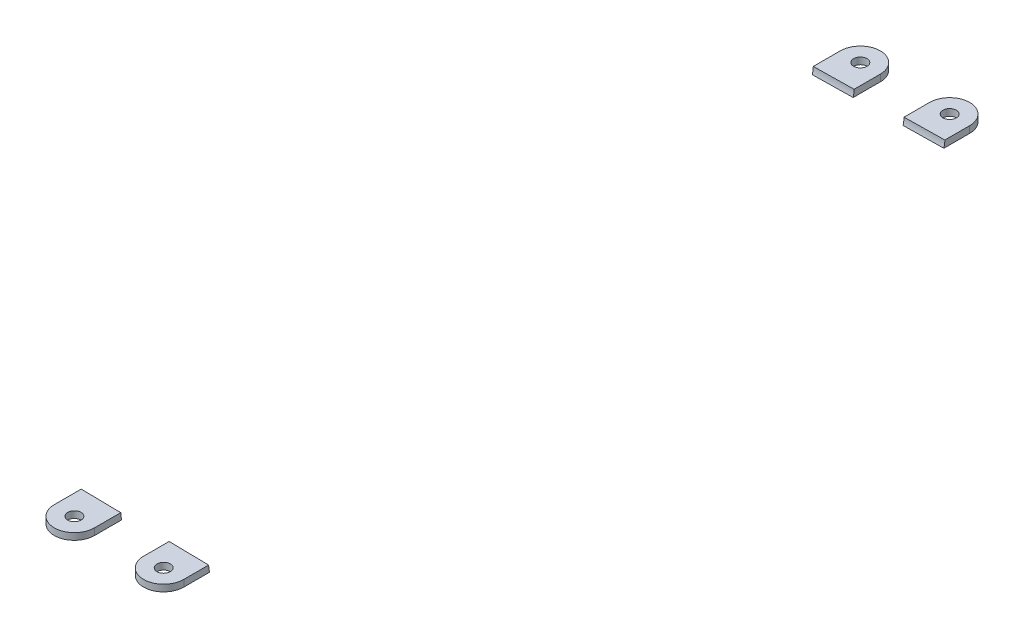
ISO-10303-21;
HEADER;
FILE_DESCRIPTION(('STEP AP214'),'2;1');
FILE_NAME('part.step','',(''),(''),'','','');
FILE_SCHEMA(('AUTOMOTIVE_DESIGN { 1 0 10303 214 1 1 1 1 }'));
ENDSEC;
DATA;
#1=APPLICATION_CONTEXT('core data for automotive mechanical design processes');
#2=APPLICATION_PROTOCOL_DEFINITION('international standard','automotive_design',2000,#1);
#3=PRODUCT_CONTEXT('',#1,'mechanical');
#4=PRODUCT('Part','Part','',(#3));
#5=PRODUCT_RELATED_PRODUCT_CATEGORY('part','',(#4));
#6=PRODUCT_DEFINITION_FORMATION('','',#4);
#7=PRODUCT_DEFINITION_CONTEXT('part definition',#1,'design');
#8=PRODUCT_DEFINITION('design','',#6,#7);
#9=PRODUCT_DEFINITION_SHAPE('','',#8);
#10=(LENGTH_UNIT() NAMED_UNIT(*) SI_UNIT(.MILLI.,.METRE.));
#11=(NAMED_UNIT(*) PLANE_ANGLE_UNIT() SI_UNIT($,.RADIAN.));
#12=(NAMED_UNIT(*) SI_UNIT($,.STERADIAN.) SOLID_ANGLE_UNIT());
#13=UNCERTAINTY_MEASURE_WITH_UNIT(LENGTH_MEASURE(1.E-05),#10,'distance_accuracy_value','');
#14=(GEOMETRIC_REPRESENTATION_CONTEXT(3) GLOBAL_UNCERTAINTY_ASSIGNED_CONTEXT((#13)) GLOBAL_UNIT_ASSIGNED_CONTEXT((#10,
#11,#12)) REPRESENTATION_CONTEXT('',''));
#15=CARTESIAN_POINT('',(0.,0.,0.));
#16=DIRECTION('',(0.,0.,1.));
#17=DIRECTION('',(1.,0.,0.));
#18=AXIS2_PLACEMENT_3D('',#15,#16,#17);
#19=CARTESIAN_POINT('',(860.,176.718242574274,176.));
#20=DIRECTION('',(0.,1.,0.));
#21=DIRECTION('',(0.,0.,-1.));
#22=AXIS2_PLACEMENT_3D('',#19,#20,#21);
#23=CYLINDRICAL_SURFACE('',#22,9.00000000000004);
#24=CARTESIAN_POINT('',(860.,179.718242574274,176.));
#25=DIRECTION('',(0.,-1.,0.));
#26=DIRECTION('',(0.,0.,-1.));
#27=AXIS2_PLACEMENT_3D('',#24,#25,#26);
#28=CIRCLE('',#27,9.00000000000004);
#29=CARTESIAN_POINT('',(869.,179.718242574274,176.));
#30=VERTEX_POINT('',#29);
#31=CARTESIAN_POINT('',(851.,179.718242574274,176.));
#32=VERTEX_POINT('',#31);
#33=EDGE_CURVE('E95',#30,#32,#28,.T.);
#34=ORIENTED_EDGE('',*,*,#33,.T.);
#35=DIRECTION('',(0.,1.,0.));
#36=VECTOR('',#35,1.);
#37=CARTESIAN_POINT('',(851.,176.718242574274,176.));
#38=LINE('',#37,#36);
#39=CARTESIAN_POINT('',(851.,176.718242574274,176.));
#40=VERTEX_POINT('',#39);
#41=EDGE_CURVE('E62',#40,#32,#38,.T.);
#42=ORIENTED_EDGE('',*,*,#41,.F.);
#43=CARTESIAN_POINT('',(860.,176.718242574274,176.));
#44=DIRECTION('',(0.,-1.,0.));
#45=DIRECTION('',(0.,0.,-1.));
#46=AXIS2_PLACEMENT_3D('',#43,#44,#45);
#47=CIRCLE('',#46,9.00000000000004);
#48=CARTESIAN_POINT('',(869.,176.718242574274,176.));
#49=VERTEX_POINT('',#48);
#50=EDGE_CURVE('E119',#49,#40,#47,.T.);
#51=ORIENTED_EDGE('',*,*,#50,.F.);
#52=DIRECTION('',(0.,1.,0.));
#53=VECTOR('',#52,1.);
#54=CARTESIAN_POINT('',(869.,176.718242574274,176.));
#55=LINE('',#54,#53);
#56=EDGE_CURVE('E103',#49,#30,#55,.T.);
#57=ORIENTED_EDGE('',*,*,#56,.T.);
#58=EDGE_LOOP('',(#34,#42,#51,#57));
#59=FACE_BOUND('',#58,.T.);
#60=ADVANCED_FACE('F48',(#59),#23,.T.);
#61=CARTESIAN_POINT('',(860.,176.718242574274,176.));
#62=DIRECTION('',(0.,1.,0.));
#63=DIRECTION('',(0.,0.,-1.));
#64=AXIS2_PLACEMENT_3D('',#61,#62,#63);
#65=CYLINDRICAL_SURFACE('',#64,3.00000000000005);
#66=CARTESIAN_POINT('',(860.,176.718242574274,176.));
#67=DIRECTION('',(0.,-1.,0.));
#68=DIRECTION('',(0.,0.,-1.));
#69=AXIS2_PLACEMENT_3D('',#66,#67,#68);
#70=CIRCLE('',#69,3.00000000000005);
#71=CARTESIAN_POINT('',(860.,176.718242574274,173.));
#72=VERTEX_POINT('',#71);
#73=EDGE_CURVE('E115',#72,#72,#70,.T.);
#74=ORIENTED_EDGE('',*,*,#73,.T.);
#75=EDGE_LOOP('',(#74));
#76=FACE_BOUND('',#75,.T.);
#77=CARTESIAN_POINT('',(860.,179.718242574274,176.));
#78=DIRECTION('',(0.,-1.,0.));
#79=DIRECTION('',(0.,0.,-1.));
#80=AXIS2_PLACEMENT_3D('',#77,#78,#79);
#81=CIRCLE('',#80,3.00000000000005);
#82=CARTESIAN_POINT('',(860.,179.718242574274,173.));
#83=VERTEX_POINT('',#82);
#84=EDGE_CURVE('E97',#83,#83,#81,.T.);
#85=ORIENTED_EDGE('',*,*,#84,.F.);
#86=EDGE_LOOP('',(#85));
#87=FACE_BOUND('',#86,.T.);
#88=ADVANCED_FACE('F141',(#76,#87),#65,.F.);
#89=CARTESIAN_POINT('',(0.,179.718242574274,0.));
#90=DIRECTION('',(0.,1.,0.));
#91=DIRECTION('',(0.,0.,-1.));
#92=AXIS2_PLACEMENT_3D('',#89,#90,#91);
#93=PLANE('',#92);
#94=ORIENTED_EDGE('',*,*,#84,.T.);
#95=EDGE_LOOP('',(#94));
#96=FACE_BOUND('',#95,.T.);
#97=DIRECTION('',(0.,0.,-1.));
#98=VECTOR('',#97,1.);
#99=CARTESIAN_POINT('',(851.,179.718242574274,0.));
#100=LINE('',#99,#98);
#101=CARTESIAN_POINT('',(851.,179.718242574274,163.931717655225));
#102=VERTEX_POINT('',#101);
#103=EDGE_CURVE('E91',#32,#102,#100,.T.);
#104=ORIENTED_EDGE('',*,*,#103,.F.);
#105=ORIENTED_EDGE('',*,*,#33,.F.);
#106=DIRECTION('',(0.,0.,1.));
#107=VECTOR('',#106,1.);
#108=CARTESIAN_POINT('',(869.,179.718242574274,0.));
#109=LINE('',#108,#107);
#110=CARTESIAN_POINT('',(869.,179.718242574274,164.218910311688));
#111=VERTEX_POINT('',#110);
#112=EDGE_CURVE('E107',#111,#30,#109,.T.);
#113=ORIENTED_EDGE('',*,*,#112,.F.);
#114=CARTESIAN_POINT('',(823.799738948488,179.718242574274,163.497732048877));
#115=CARTESIAN_POINT('',(832.265328143675,179.718242574274,163.632802485254));
#116=CARTESIAN_POINT('',(840.730917342842,179.718242574274,163.767872672144));
#117=CARTESIAN_POINT('',(864.864424700862,179.718242574274,164.152926948934));
#118=CARTESIAN_POINT('',(880.53234286937,179.718242574274,164.402910433738));
#119=CARTESIAN_POINT('',(896.200261051512,179.718242574274,164.65289306396));
#120=B_SPLINE_CURVE_WITH_KNOTS('',3,(#114,#115,#116,#117,#118,#119),.UNSPECIFIED.,.F.,.F.,(4,2,
4),(0.,25.4,72.4097368988536),.UNSPECIFIED.);
#121=EDGE_CURVE('E12',#102,#111,#120,.T.);
#122=ORIENTED_EDGE('',*,*,#121,.F.);
#123=EDGE_LOOP('',(#104,#105,#113,#122));
#124=FACE_BOUND('',#123,.T.);
#125=ADVANCED_FACE('F92',(#96,#124),#93,.T.);
#126=CARTESIAN_POINT('',(0.,176.718242574274,0.));
#127=DIRECTION('',(0.,1.,0.));
#128=DIRECTION('',(0.,0.,-1.));
#129=AXIS2_PLACEMENT_3D('',#126,#127,#128);
#130=PLANE('',#129);
#131=ORIENTED_EDGE('',*,*,#73,.F.);
#132=EDGE_LOOP('',(#131));
#133=FACE_BOUND('',#132,.T.);
#134=CARTESIAN_POINT('',(823.799738948488,176.718242574274,163.067347797898));
#135=CARTESIAN_POINT('',(832.265333823461,176.718242574274,163.202061781117));
#136=CARTESIAN_POINT('',(840.730928702838,176.718242574274,163.336775487568));
#137=CARTESIAN_POINT('',(864.864436059831,176.718242574274,163.72081318261));
#138=CARTESIAN_POINT('',(880.532348548129,176.718242574274,163.970136499937));
#139=CARTESIAN_POINT('',(896.200261051512,176.718242574274,164.21945886923));
#140=B_SPLINE_CURVE_WITH_KNOTS('',3,(#134,#135,#136,#137,#138,#139),.UNSPECIFIED.,.F.,.F.,(4,2,
4),(0.,25.3999999999999,72.4096883069602),.UNSPECIFIED.);
#141=CARTESIAN_POINT('',(851.,176.718242574274,163.500187722351));
#142=VERTEX_POINT('',#141);
#143=CARTESIAN_POINT('',(869.,176.718242574274,163.786622111074));
#144=VERTEX_POINT('',#143);
#145=EDGE_CURVE('E109',#142,#144,#140,.T.);
#146=ORIENTED_EDGE('',*,*,#145,.T.);
#147=DIRECTION('',(0.,0.,1.));
#148=VECTOR('',#147,1.);
#149=CARTESIAN_POINT('',(869.,176.718242574274,0.));
#150=LINE('',#149,#148);
#151=EDGE_CURVE('E114',#144,#49,#150,.T.);
#152=ORIENTED_EDGE('',*,*,#151,.T.);
#153=ORIENTED_EDGE('',*,*,#50,.T.);
#154=DIRECTION('',(0.,0.,-1.));
#155=VECTOR('',#154,1.);
#156=CARTESIAN_POINT('',(851.,176.718242574274,0.));
#157=LINE('',#156,#155);
#158=EDGE_CURVE('E77',#40,#142,#157,.T.);
#159=ORIENTED_EDGE('',*,*,#158,.T.);
#160=EDGE_LOOP('',(#146,#152,#153,#159));
#161=FACE_BOUND('',#160,.T.);
#162=ADVANCED_FACE('F134',(#133,#161),#130,.F.);
#163=CARTESIAN_POINT('',(851.,176.718242574274,0.));
#164=DIRECTION('',(-1.,0.,0.));
#165=DIRECTION('',(0.,0.,-1.));
#166=AXIS2_PLACEMENT_3D('',#163,#164,#165);
#167=PLANE('',#166);
#168=ORIENTED_EDGE('',*,*,#158,.F.);
#169=ORIENTED_EDGE('',*,*,#41,.T.);
#170=ORIENTED_EDGE('',*,*,#103,.T.);
#171=CARTESIAN_POINT('',(851.,180.01326513551,151.233528858843));
#172=DIRECTION('',(1.,0.,0.));
#173=DIRECTION('',(0.,-0.0107531886792747,-0.9999421827952));
#174=AXIS2_PLACEMENT_3D('',#171,#172,#173);
#175=ELLIPSE('',#174,12.7016173954027,12.7);
#176=EDGE_CURVE('E203',#142,#102,#175,.F.);
#177=ORIENTED_EDGE('',*,*,#176,.F.);
#178=EDGE_LOOP('',(#168,#169,#170,#177));
#179=FACE_BOUND('',#178,.T.);
#180=ADVANCED_FACE('F100',(#179),#167,.T.);
#181=CARTESIAN_POINT('',(869.,176.718242574274,0.));
#182=DIRECTION('',(1.,0.,0.));
#183=DIRECTION('',(0.,0.,1.));
#184=AXIS2_PLACEMENT_3D('',#181,#182,#183);
#185=PLANE('',#184);
#186=ORIENTED_EDGE('',*,*,#112,.T.);
#187=ORIENTED_EDGE('',*,*,#56,.F.);
#188=ORIENTED_EDGE('',*,*,#151,.F.);
#189=CARTESIAN_POINT('',(869.,180.016354327056,151.520793690643));
#190=DIRECTION('',(-1.,0.,0.));
#191=DIRECTION('',(0.,-0.0107531886792747,-0.9999421827952));
#192=AXIS2_PLACEMENT_3D('',#189,#190,#191);
#193=ELLIPSE('',#192,12.7016173954027,12.7);
#194=EDGE_CURVE('E69',#111,#144,#193,.F.);
#195=ORIENTED_EDGE('',*,*,#194,.F.);
#196=EDGE_LOOP('',(#186,#187,#188,#195));
#197=FACE_BOUND('',#196,.T.);
#198=ADVANCED_FACE('F50',(#197),#185,.T.);
#199=CARTESIAN_POINT('',(1400.,180.107485477653,159.995106228733));
#200=DIRECTION('',(-0.999872662248254,-0.000171599898609785,-0.015957125118991));
#201=DIRECTION('',(0.015957125353932,0.,-0.999872676969642));
#202=AXIS2_PLACEMENT_3D('',#199,#200,#201);
#203=CYLINDRICAL_SURFACE('',#202,12.7);
#204=ORIENTED_EDGE('',*,*,#145,.F.);
#205=ORIENTED_EDGE('',*,*,#176,.T.);
#206=ORIENTED_EDGE('',*,*,#121,.T.);
#207=ORIENTED_EDGE('',*,*,#194,.T.);
#208=EDGE_LOOP('',(#204,#205,#206,#207));
#209=FACE_BOUND('',#208,.T.);
#210=ADVANCED_FACE('F132',(#209),#203,.F.);
#211=CLOSED_SHELL('',(#60,#88,#125,#162,#180,#198,#210));
#212=MANIFOLD_SOLID_BREP('B2',#211);
#213=CARTESIAN_POINT('',(900.,176.718242574274,176.));
#214=DIRECTION('',(0.,1.,0.));
#215=DIRECTION('',(0.,0.,-1.));
#216=AXIS2_PLACEMENT_3D('',#213,#214,#215);
#217=CYLINDRICAL_SURFACE('',#216,9.00000000000004);
#218=CARTESIAN_POINT('',(900.,179.718242574274,176.));
#219=DIRECTION('',(0.,-1.,0.));
#220=DIRECTION('',(0.,0.,-1.));
#221=AXIS2_PLACEMENT_3D('',#218,#219,#220);
#222=CIRCLE('',#221,9.00000000000004);
#223=CARTESIAN_POINT('',(909.,179.718242574274,176.));
#224=VERTEX_POINT('',#223);
#225=CARTESIAN_POINT('',(891.,179.718242574274,176.));
#226=VERTEX_POINT('',#225);
#227=EDGE_CURVE('E270',#224,#226,#222,.T.);
#228=ORIENTED_EDGE('',*,*,#227,.T.);
#229=DIRECTION('',(0.,1.,0.));
#230=VECTOR('',#229,1.);
#231=CARTESIAN_POINT('',(891.,176.718242574274,176.));
#232=LINE('',#231,#230);
#233=CARTESIAN_POINT('',(891.,176.718242574274,176.));
#234=VERTEX_POINT('',#233);
#235=EDGE_CURVE('E237',#234,#226,#232,.T.);
#236=ORIENTED_EDGE('',*,*,#235,.F.);
#237=CARTESIAN_POINT('',(900.,176.718242574274,176.));
#238=DIRECTION('',(0.,-1.,0.));
#239=DIRECTION('',(0.,0.,-1.));
#240=AXIS2_PLACEMENT_3D('',#237,#238,#239);
#241=CIRCLE('',#240,9.00000000000004);
#242=CARTESIAN_POINT('',(909.,176.718242574274,176.));
#243=VERTEX_POINT('',#242);
#244=EDGE_CURVE('E294',#243,#234,#241,.T.);
#245=ORIENTED_EDGE('',*,*,#244,.F.);
#246=DIRECTION('',(0.,1.,0.));
#247=VECTOR('',#246,1.);
#248=CARTESIAN_POINT('',(909.,176.718242574274,176.));
#249=LINE('',#248,#247);
#250=EDGE_CURVE('E278',#243,#224,#249,.T.);
#251=ORIENTED_EDGE('',*,*,#250,.T.);
#252=EDGE_LOOP('',(#228,#236,#245,#251));
#253=FACE_BOUND('',#252,.T.);
#254=ADVANCED_FACE('F223',(#253),#217,.T.);
#255=CARTESIAN_POINT('',(900.,176.718242574274,176.));
#256=DIRECTION('',(0.,1.,0.));
#257=DIRECTION('',(0.,0.,-1.));
#258=AXIS2_PLACEMENT_3D('',#255,#256,#257);
#259=CYLINDRICAL_SURFACE('',#258,3.00000000000005);
#260=CARTESIAN_POINT('',(900.,176.718242574274,176.));
#261=DIRECTION('',(0.,-1.,0.));
#262=DIRECTION('',(0.,0.,-1.));
#263=AXIS2_PLACEMENT_3D('',#260,#261,#262);
#264=CIRCLE('',#263,3.00000000000005);
#265=CARTESIAN_POINT('',(900.,176.718242574274,173.));
#266=VERTEX_POINT('',#265);
#267=EDGE_CURVE('E290',#266,#266,#264,.T.);
#268=ORIENTED_EDGE('',*,*,#267,.T.);
#269=EDGE_LOOP('',(#268));
#270=FACE_BOUND('',#269,.T.);
#271=CARTESIAN_POINT('',(900.,179.718242574274,176.));
#272=DIRECTION('',(0.,-1.,0.));
#273=DIRECTION('',(0.,0.,-1.));
#274=AXIS2_PLACEMENT_3D('',#271,#272,#273);
#275=CIRCLE('',#274,3.00000000000005);
#276=CARTESIAN_POINT('',(900.,179.718242574274,173.));
#277=VERTEX_POINT('',#276);
#278=EDGE_CURVE('E272',#277,#277,#275,.T.);
#279=ORIENTED_EDGE('',*,*,#278,.F.);
#280=EDGE_LOOP('',(#279));
#281=FACE_BOUND('',#280,.T.);
#282=ADVANCED_FACE('F316',(#270,#281),#259,.F.);
#283=CARTESIAN_POINT('',(0.,179.718242574274,0.));
#284=DIRECTION('',(0.,1.,0.));
#285=DIRECTION('',(0.,0.,-1.));
#286=AXIS2_PLACEMENT_3D('',#283,#284,#285);
#287=PLANE('',#286);
#288=ORIENTED_EDGE('',*,*,#278,.T.);
#289=EDGE_LOOP('',(#288));
#290=FACE_BOUND('',#289,.T.);
#291=DIRECTION('',(0.,0.,-1.));
#292=VECTOR('',#291,1.);
#293=CARTESIAN_POINT('',(891.,179.718242574274,0.));
#294=LINE('',#293,#292);
#295=CARTESIAN_POINT('',(891.,179.718242574274,164.569922537046));
#296=VERTEX_POINT('',#295);
#297=EDGE_CURVE('E266',#226,#296,#294,.T.);
#298=ORIENTED_EDGE('',*,*,#297,.F.);
#299=ORIENTED_EDGE('',*,*,#227,.F.);
#300=DIRECTION('',(0.,0.,1.));
#301=VECTOR('',#300,1.);
#302=CARTESIAN_POINT('',(909.,179.718242574274,0.));
#303=LINE('',#302,#301);
#304=CARTESIAN_POINT('',(909.,179.718242574274,164.857113522063));
#305=VERTEX_POINT('',#304);
#306=EDGE_CURVE('E282',#305,#224,#303,.T.);
#307=ORIENTED_EDGE('',*,*,#306,.F.);
#308=CARTESIAN_POINT('',(864.484150231282,179.718242574274,164.146859332852));
#309=CARTESIAN_POINT('',(872.949739439222,179.718242574274,164.28192896991));
#310=CARTESIAN_POINT('',(881.415328651142,179.718242574274,164.416998357472));
#311=CARTESIAN_POINT('',(905.092561821416,179.718242574274,164.794770464597));
#312=CARTESIAN_POINT('',(920.304205788641,179.718242574274,165.03747262809));
#313=CARTESIAN_POINT('',(935.515849768719,179.718242574274,165.280173986019));
#314=B_SPLINE_CURVE_WITH_KNOTS('',3,(#308,#309,#310,#311,#312,#313),.UNSPECIFIED.,.F.,.F.,(4,2,
4),(0.,25.4,71.0407400107842),.UNSPECIFIED.);
#315=EDGE_CURVE('E46',#296,#305,#314,.T.);
#316=ORIENTED_EDGE('',*,*,#315,.F.);
#317=EDGE_LOOP('',(#298,#299,#307,#316));
#318=FACE_BOUND('',#317,.T.);
#319=ADVANCED_FACE('F267',(#290,#318),#287,.T.);
#320=CARTESIAN_POINT('',(0.,176.718242574274,0.));
#321=DIRECTION('',(0.,1.,0.));
#322=DIRECTION('',(0.,0.,-1.));
#323=AXIS2_PLACEMENT_3D('',#320,#321,#322);
#324=PLANE('',#323);
#325=ORIENTED_EDGE('',*,*,#267,.F.);
#326=EDGE_LOOP('',(#325));
#327=FACE_BOUND('',#326,.T.);
#328=CARTESIAN_POINT('',(864.484150231282,176.718242574274,163.714761374592));
#329=CARTESIAN_POINT('',(872.949745120363,176.718242574274,163.849474471194));
#330=CARTESIAN_POINT('',(881.415340013852,176.718242574274,163.984187290902));
#331=CARTESIAN_POINT('',(905.092573183177,176.718242574274,164.36096179116));
#332=CARTESIAN_POINT('',(920.304211468834,176.718242574274,164.603022854577));
#333=CARTESIAN_POINT('',(935.515849768719,176.718242574274,164.845083023967));
#334=B_SPLINE_CURVE_WITH_KNOTS('',3,(#328,#329,#330,#331,#332,#333),.UNSPECIFIED.,.F.,.F.,(4,2,
4),(0.,25.4,71.0406923263548),.UNSPECIFIED.);
#335=CARTESIAN_POINT('',(891.,176.718242574274,164.136707452889));
#336=VERTEX_POINT('',#335);
#337=CARTESIAN_POINT('',(909.,176.718242574274,164.423139986934));
#338=VERTEX_POINT('',#337);
#339=EDGE_CURVE('E284',#336,#338,#334,.T.);
#340=ORIENTED_EDGE('',*,*,#339,.T.);
#341=DIRECTION('',(0.,0.,1.));
#342=VECTOR('',#341,1.);
#343=CARTESIAN_POINT('',(909.,176.718242574274,0.));
#344=LINE('',#343,#342);
#345=EDGE_CURVE('E289',#338,#243,#344,.T.);
#346=ORIENTED_EDGE('',*,*,#345,.T.);
#347=ORIENTED_EDGE('',*,*,#244,.T.);
#348=DIRECTION('',(0.,0.,-1.));
#349=VECTOR('',#348,1.);
#350=CARTESIAN_POINT('',(891.,176.718242574274,0.));
#351=LINE('',#350,#349);
#352=EDGE_CURVE('E252',#234,#336,#351,.T.);
#353=ORIENTED_EDGE('',*,*,#352,.T.);
#354=EDGE_LOOP('',(#340,#346,#347,#353));
#355=FACE_BOUND('',#354,.T.);
#356=ADVANCED_FACE('F309',(#327,#355),#324,.F.);
#357=CARTESIAN_POINT('',(891.,176.718242574274,0.));
#358=DIRECTION('',(-1.,0.,0.));
#359=DIRECTION('',(0.,0.,-1.));
#360=AXIS2_PLACEMENT_3D('',#357,#358,#359);
#361=PLANE('',#360);
#362=ORIENTED_EDGE('',*,*,#352,.F.);
#363=ORIENTED_EDGE('',*,*,#235,.T.);
#364=ORIENTED_EDGE('',*,*,#297,.T.);
#365=CARTESIAN_POINT('',(891.,180.020130005611,151.871895151731));
#366=DIRECTION('',(1.,0.,0.));
#367=DIRECTION('',(0.,-0.0107531886792747,-0.9999421827952));
#368=AXIS2_PLACEMENT_3D('',#365,#366,#367);
#369=ELLIPSE('',#368,12.7016173954027,12.7);
#370=EDGE_CURVE('E378',#336,#296,#369,.F.);
#371=ORIENTED_EDGE('',*,*,#370,.F.);
#372=EDGE_LOOP('',(#362,#363,#364,#371));
#373=FACE_BOUND('',#372,.T.);
#374=ADVANCED_FACE('F275',(#373),#361,.T.);
#375=CARTESIAN_POINT('',(909.,176.718242574274,0.));
#376=DIRECTION('',(1.,0.,0.));
#377=DIRECTION('',(0.,0.,1.));
#378=AXIS2_PLACEMENT_3D('',#375,#376,#377);
#379=PLANE('',#378);
#380=ORIENTED_EDGE('',*,*,#306,.T.);
#381=ORIENTED_EDGE('',*,*,#250,.F.);
#382=ORIENTED_EDGE('',*,*,#345,.F.);
#383=CARTESIAN_POINT('',(909.,180.023219197157,152.159159983531));
#384=DIRECTION('',(-1.,0.,0.));
#385=DIRECTION('',(0.,-0.0107531886792747,-0.9999421827952));
#386=AXIS2_PLACEMENT_3D('',#383,#384,#385);
#387=ELLIPSE('',#386,12.7016173954027,12.7);
#388=EDGE_CURVE('E244',#305,#338,#387,.F.);
#389=ORIENTED_EDGE('',*,*,#388,.F.);
#390=EDGE_LOOP('',(#380,#381,#382,#389));
#391=FACE_BOUND('',#390,.T.);
#392=ADVANCED_FACE('F225',(#391),#379,.T.);
#393=CARTESIAN_POINT('',(1400.,180.107485477653,159.995106228733));
#394=DIRECTION('',(-0.999872662248254,-0.000171599898609785,-0.015957125118991));
#395=DIRECTION('',(0.015957125353932,0.,-0.999872676969642));
#396=AXIS2_PLACEMENT_3D('',#393,#394,#395);
#397=CYLINDRICAL_SURFACE('',#396,12.7);
#398=ORIENTED_EDGE('',*,*,#339,.F.);
#399=ORIENTED_EDGE('',*,*,#370,.T.);
#400=ORIENTED_EDGE('',*,*,#315,.T.);
#401=ORIENTED_EDGE('',*,*,#388,.T.);
#402=EDGE_LOOP('',(#398,#399,#400,#401));
#403=FACE_BOUND('',#402,.T.);
#404=ADVANCED_FACE('F307',(#403),#397,.F.);
#405=CLOSED_SHELL('',(#254,#282,#319,#356,#374,#392,#404));
#406=MANIFOLD_SOLID_BREP('B6',#405);
#407=CARTESIAN_POINT('',(900.,176.718242574274,-176.));
#408=DIRECTION('',(0.,1.,0.));
#409=DIRECTION('',(0.,0.,1.));
#410=AXIS2_PLACEMENT_3D('',#407,#408,#409);
#411=CYLINDRICAL_SURFACE('',#410,9.00000000000004);
#412=CARTESIAN_POINT('',(900.,179.718242574274,-176.));
#413=DIRECTION('',(0.,1.,0.));
#414=DIRECTION('',(0.,0.,1.));
#415=AXIS2_PLACEMENT_3D('',#412,#413,#414);
#416=CIRCLE('',#415,9.00000000000004);
#417=CARTESIAN_POINT('',(909.,179.718242574274,-176.));
#418=VERTEX_POINT('',#417);
#419=CARTESIAN_POINT('',(891.,179.718242574274,-176.));
#420=VERTEX_POINT('',#419);
#421=EDGE_CURVE('E440',#418,#420,#416,.T.);
#422=ORIENTED_EDGE('',*,*,#421,.F.);
#423=DIRECTION('',(0.,1.,0.));
#424=VECTOR('',#423,1.);
#425=CARTESIAN_POINT('',(909.,176.718242574274,-176.));
#426=LINE('',#425,#424);
#427=CARTESIAN_POINT('',(909.,176.718242574274,-176.));
#428=VERTEX_POINT('',#427);
#429=EDGE_CURVE('E443',#428,#418,#426,.T.);
#430=ORIENTED_EDGE('',*,*,#429,.F.);
#431=CARTESIAN_POINT('',(900.,176.718242574274,-176.));
#432=DIRECTION('',(0.,1.,0.));
#433=DIRECTION('',(0.,0.,1.));
#434=AXIS2_PLACEMENT_3D('',#431,#432,#433);
#435=CIRCLE('',#434,9.00000000000004);
#436=CARTESIAN_POINT('',(891.,176.718242574274,-176.));
#437=VERTEX_POINT('',#436);
#438=EDGE_CURVE('E442',#428,#437,#435,.T.);
#439=ORIENTED_EDGE('',*,*,#438,.T.);
#440=DIRECTION('',(0.,1.,0.));
#441=VECTOR('',#440,1.);
#442=CARTESIAN_POINT('',(891.,176.718242574274,-176.));
#443=LINE('',#442,#441);
#444=EDGE_CURVE('E411',#437,#420,#443,.T.);
#445=ORIENTED_EDGE('',*,*,#444,.T.);
#446=EDGE_LOOP('',(#422,#430,#439,#445));
#447=FACE_BOUND('',#446,.T.);
#448=ADVANCED_FACE('F397',(#447),#411,.T.);
#449=CARTESIAN_POINT('',(900.,176.718242574274,-176.));
#450=DIRECTION('',(0.,1.,0.));
#451=DIRECTION('',(0.,0.,1.));
#452=AXIS2_PLACEMENT_3D('',#449,#450,#451);
#453=CYLINDRICAL_SURFACE('',#452,3.00000000000005);
#454=CARTESIAN_POINT('',(900.,176.718242574274,-176.));
#455=DIRECTION('',(0.,1.,0.));
#456=DIRECTION('',(0.,0.,1.));
#457=AXIS2_PLACEMENT_3D('',#454,#455,#456);
#458=CIRCLE('',#457,3.00000000000005);
#459=CARTESIAN_POINT('',(900.,176.718242574274,-173.));
#460=VERTEX_POINT('',#459);
#461=EDGE_CURVE('E466',#460,#460,#458,.T.);
#462=ORIENTED_EDGE('',*,*,#461,.F.);
#463=EDGE_LOOP('',(#462));
#464=FACE_BOUND('',#463,.T.);
#465=CARTESIAN_POINT('',(900.,179.718242574274,-176.));
#466=DIRECTION('',(0.,1.,0.));
#467=DIRECTION('',(0.,0.,1.));
#468=AXIS2_PLACEMENT_3D('',#465,#466,#467);
#469=CIRCLE('',#468,3.00000000000005);
#470=CARTESIAN_POINT('',(900.,179.718242574274,-173.));
#471=VERTEX_POINT('',#470);
#472=EDGE_CURVE('E453',#471,#471,#469,.T.);
#473=ORIENTED_EDGE('',*,*,#472,.T.);
#474=EDGE_LOOP('',(#473));
#475=FACE_BOUND('',#474,.T.);
#476=ADVANCED_FACE('F493',(#464,#475),#453,.F.);
#477=CARTESIAN_POINT('',(0.,179.718242574274,0.));
#478=DIRECTION('',(0.,1.,0.));
#479=DIRECTION('',(0.,0.,1.));
#480=AXIS2_PLACEMENT_3D('',#477,#478,#479);
#481=PLANE('',#480);
#482=ORIENTED_EDGE('',*,*,#472,.F.);
#483=EDGE_LOOP('',(#482));
#484=FACE_BOUND('',#483,.T.);
#485=DIRECTION('',(0.,0.,1.));
#486=VECTOR('',#485,1.);
#487=CARTESIAN_POINT('',(891.,179.718242574274,0.));
#488=LINE('',#487,#486);
#489=CARTESIAN_POINT('',(891.,179.718242574274,-164.569922537046));
#490=VERTEX_POINT('',#489);
#491=EDGE_CURVE('E447',#420,#490,#488,.T.);
#492=ORIENTED_EDGE('',*,*,#491,.T.);
#493=CARTESIAN_POINT('',(864.484150231282,179.718242574274,-164.146859332852));
#494=CARTESIAN_POINT('',(872.949739439222,179.718242574274,-164.28192896991));
#495=CARTESIAN_POINT('',(881.415328651142,179.718242574274,-164.416998357472));
#496=CARTESIAN_POINT('',(905.092561821416,179.718242574274,-164.794770464597));
#497=CARTESIAN_POINT('',(920.304205788641,179.718242574274,-165.03747262809));
#498=CARTESIAN_POINT('',(935.515849768719,179.718242574274,-165.280173986019));
#499=B_SPLINE_CURVE_WITH_KNOTS('',3,(#493,#494,#495,#496,#497,#498),.UNSPECIFIED.,.F.,.F.,(4,2,
4),(0.,25.4,71.0407400107842),.UNSPECIFIED.);
#500=CARTESIAN_POINT('',(909.,179.718242574274,-164.857113522063));
#501=VERTEX_POINT('',#500);
#502=EDGE_CURVE('E221',#490,#501,#499,.T.);
#503=ORIENTED_EDGE('',*,*,#502,.T.);
#504=DIRECTION('',(0.,0.,-1.));
#505=VECTOR('',#504,1.);
#506=CARTESIAN_POINT('',(909.,179.718242574274,0.));
#507=LINE('',#506,#505);
#508=EDGE_CURVE('E457',#501,#418,#507,.T.);
#509=ORIENTED_EDGE('',*,*,#508,.T.);
#510=ORIENTED_EDGE('',*,*,#421,.T.);
#511=EDGE_LOOP('',(#492,#503,#509,#510));
#512=FACE_BOUND('',#511,.T.);
#513=ADVANCED_FACE('F455',(#484,#512),#481,.T.);
#514=CARTESIAN_POINT('',(0.,176.718242574274,0.));
#515=DIRECTION('',(0.,1.,0.));
#516=DIRECTION('',(0.,0.,1.));
#517=AXIS2_PLACEMENT_3D('',#514,#515,#516);
#518=PLANE('',#517);
#519=ORIENTED_EDGE('',*,*,#461,.T.);
#520=EDGE_LOOP('',(#519));
#521=FACE_BOUND('',#520,.T.);
#522=CARTESIAN_POINT('',(864.484150231282,176.718242574274,-163.714761374592));
#523=CARTESIAN_POINT('',(872.949745120363,176.718242574274,-163.849474471194));
#524=CARTESIAN_POINT('',(881.415340013852,176.718242574274,-163.984187290902));
#525=CARTESIAN_POINT('',(905.092573183177,176.718242574274,-164.36096179116));
#526=CARTESIAN_POINT('',(920.304211468834,176.718242574274,-164.603022854577));
#527=CARTESIAN_POINT('',(935.515849768719,176.718242574274,-164.845083023967));
#528=B_SPLINE_CURVE_WITH_KNOTS('',3,(#522,#523,#524,#525,#526,#527),.UNSPECIFIED.,.F.,.F.,(4,2,
4),(0.,25.4,71.0406923263548),.UNSPECIFIED.);
#529=CARTESIAN_POINT('',(891.,176.718242574274,-164.136707452889));
#530=VERTEX_POINT('',#529);
#531=CARTESIAN_POINT('',(909.,176.718242574274,-164.423139986934));
#532=VERTEX_POINT('',#531);
#533=EDGE_CURVE('E460',#530,#532,#528,.T.);
#534=ORIENTED_EDGE('',*,*,#533,.F.);
#535=DIRECTION('',(0.,0.,1.));
#536=VECTOR('',#535,1.);
#537=CARTESIAN_POINT('',(891.,176.718242574274,0.));
#538=LINE('',#537,#536);
#539=EDGE_CURVE('E469',#437,#530,#538,.T.);
#540=ORIENTED_EDGE('',*,*,#539,.F.);
#541=ORIENTED_EDGE('',*,*,#438,.F.);
#542=DIRECTION('',(0.,0.,-1.));
#543=VECTOR('',#542,1.);
#544=CARTESIAN_POINT('',(909.,176.718242574274,0.));
#545=LINE('',#544,#543);
#546=EDGE_CURVE('E465',#532,#428,#545,.T.);
#547=ORIENTED_EDGE('',*,*,#546,.F.);
#548=EDGE_LOOP('',(#534,#540,#541,#547));
#549=FACE_BOUND('',#548,.T.);
#550=ADVANCED_FACE('F483',(#521,#549),#518,.F.);
#551=CARTESIAN_POINT('',(891.,176.718242574274,0.));
#552=DIRECTION('',(-1.,0.,0.));
#553=DIRECTION('',(0.,0.,1.));
#554=AXIS2_PLACEMENT_3D('',#551,#552,#553);
#555=PLANE('',#554);
#556=ORIENTED_EDGE('',*,*,#539,.T.);
#557=CARTESIAN_POINT('',(891.,180.020130005611,-151.871895151731));
#558=DIRECTION('',(-1.,0.,0.));
#559=DIRECTION('',(0.,-0.0107531886792747,0.9999421827952));
#560=AXIS2_PLACEMENT_3D('',#557,#558,#559);
#561=ELLIPSE('',#560,12.7016173954027,12.7);
#562=EDGE_CURVE('E451',#530,#490,#561,.F.);
#563=ORIENTED_EDGE('',*,*,#562,.T.);
#564=ORIENTED_EDGE('',*,*,#491,.F.);
#565=ORIENTED_EDGE('',*,*,#444,.F.);
#566=EDGE_LOOP('',(#556,#563,#564,#565));
#567=FACE_BOUND('',#566,.T.);
#568=ADVANCED_FACE('F448',(#567),#555,.T.);
#569=CARTESIAN_POINT('',(909.,176.718242574274,0.));
#570=DIRECTION('',(1.,0.,0.));
#571=DIRECTION('',(0.,0.,-1.));
#572=AXIS2_PLACEMENT_3D('',#569,#570,#571);
#573=PLANE('',#572);
#574=ORIENTED_EDGE('',*,*,#508,.F.);
#575=CARTESIAN_POINT('',(909.,180.023219197157,-152.159159983531));
#576=DIRECTION('',(1.,0.,0.));
#577=DIRECTION('',(0.,-0.0107531886792747,0.9999421827952));
#578=AXIS2_PLACEMENT_3D('',#575,#576,#577);
#579=ELLIPSE('',#578,12.7016173954027,12.7);
#580=EDGE_CURVE('E418',#501,#532,#579,.F.);
#581=ORIENTED_EDGE('',*,*,#580,.T.);
#582=ORIENTED_EDGE('',*,*,#546,.T.);
#583=ORIENTED_EDGE('',*,*,#429,.T.);
#584=EDGE_LOOP('',(#574,#581,#582,#583));
#585=FACE_BOUND('',#584,.T.);
#586=ADVANCED_FACE('F399',(#585),#573,.T.);
#587=CARTESIAN_POINT('',(1400.,180.107485477653,-159.995106228733));
#588=DIRECTION('',(-0.999872662248254,-0.000171599898609785,0.015957125118991));
#589=DIRECTION('',(0.015957125353932,0.,0.999872676969642));
#590=AXIS2_PLACEMENT_3D('',#587,#588,#589);
#591=CYLINDRICAL_SURFACE('',#590,12.7);
#592=ORIENTED_EDGE('',*,*,#533,.T.);
#593=ORIENTED_EDGE('',*,*,#580,.F.);
#594=ORIENTED_EDGE('',*,*,#502,.F.);
#595=ORIENTED_EDGE('',*,*,#562,.F.);
#596=EDGE_LOOP('',(#592,#593,#594,#595));
#597=FACE_BOUND('',#596,.T.);
#598=ADVANCED_FACE('F485',(#597),#591,.F.);
#599=CLOSED_SHELL('',(#448,#476,#513,#550,#568,#586,#598));
#600=MANIFOLD_SOLID_BREP('B40',#599);
#601=CARTESIAN_POINT('',(860.,176.718242574274,-176.));
#602=DIRECTION('',(0.,1.,0.));
#603=DIRECTION('',(0.,0.,1.));
#604=AXIS2_PLACEMENT_3D('',#601,#602,#603);
#605=CYLINDRICAL_SURFACE('',#604,9.00000000000004);
#606=CARTESIAN_POINT('',(860.,179.718242574274,-176.));
#607=DIRECTION('',(0.,1.,0.));
#608=DIRECTION('',(0.,0.,1.));
#609=AXIS2_PLACEMENT_3D('',#606,#607,#608);
#610=CIRCLE('',#609,9.00000000000004);
#611=CARTESIAN_POINT('',(869.,179.718242574274,-176.));
#612=VERTEX_POINT('',#611);
#613=CARTESIAN_POINT('',(851.,179.718242574274,-176.));
#614=VERTEX_POINT('',#613);
#615=EDGE_CURVE('E605',#612,#614,#610,.T.);
#616=ORIENTED_EDGE('',*,*,#615,.F.);
#617=DIRECTION('',(0.,1.,0.));
#618=VECTOR('',#617,1.);
#619=CARTESIAN_POINT('',(869.,176.718242574274,-176.));
#620=LINE('',#619,#618);
#621=CARTESIAN_POINT('',(869.,176.718242574274,-176.));
#622=VERTEX_POINT('',#621);
#623=EDGE_CURVE('E608',#622,#612,#620,.T.);
#624=ORIENTED_EDGE('',*,*,#623,.F.);
#625=CARTESIAN_POINT('',(860.,176.718242574274,-176.));
#626=DIRECTION('',(0.,1.,0.));
#627=DIRECTION('',(0.,0.,1.));
#628=AXIS2_PLACEMENT_3D('',#625,#626,#627);
#629=CIRCLE('',#628,9.00000000000004);
#630=CARTESIAN_POINT('',(851.,176.718242574274,-176.));
#631=VERTEX_POINT('',#630);
#632=EDGE_CURVE('E607',#622,#631,#629,.T.);
#633=ORIENTED_EDGE('',*,*,#632,.T.);
#634=DIRECTION('',(0.,1.,0.));
#635=VECTOR('',#634,1.);
#636=CARTESIAN_POINT('',(851.,176.718242574274,-176.));
#637=LINE('',#636,#635);
#638=EDGE_CURVE('E576',#631,#614,#637,.T.);
#639=ORIENTED_EDGE('',*,*,#638,.T.);
#640=EDGE_LOOP('',(#616,#624,#633,#639));
#641=FACE_BOUND('',#640,.T.);
#642=ADVANCED_FACE('F562',(#641),#605,.T.);
#643=CARTESIAN_POINT('',(860.,176.718242574274,-176.));
#644=DIRECTION('',(0.,1.,0.));
#645=DIRECTION('',(0.,0.,1.));
#646=AXIS2_PLACEMENT_3D('',#643,#644,#645);
#647=CYLINDRICAL_SURFACE('',#646,3.00000000000005);
#648=CARTESIAN_POINT('',(860.,176.718242574274,-176.));
#649=DIRECTION('',(0.,1.,0.));
#650=DIRECTION('',(0.,0.,1.));
#651=AXIS2_PLACEMENT_3D('',#648,#649,#650);
#652=CIRCLE('',#651,3.00000000000005);
#653=CARTESIAN_POINT('',(860.,176.718242574274,-173.));
#654=VERTEX_POINT('',#653);
#655=EDGE_CURVE('E631',#654,#654,#652,.T.);
#656=ORIENTED_EDGE('',*,*,#655,.F.);
#657=EDGE_LOOP('',(#656));
#658=FACE_BOUND('',#657,.T.);
#659=CARTESIAN_POINT('',(860.,179.718242574274,-176.));
#660=DIRECTION('',(0.,1.,0.));
#661=DIRECTION('',(0.,0.,1.));
#662=AXIS2_PLACEMENT_3D('',#659,#660,#661);
#663=CIRCLE('',#662,3.00000000000005);
#664=CARTESIAN_POINT('',(860.,179.718242574274,-173.));
#665=VERTEX_POINT('',#664);
#666=EDGE_CURVE('E618',#665,#665,#663,.T.);
#667=ORIENTED_EDGE('',*,*,#666,.T.);
#668=EDGE_LOOP('',(#667));
#669=FACE_BOUND('',#668,.T.);
#670=ADVANCED_FACE('F658',(#658,#669),#647,.F.);
#671=CARTESIAN_POINT('',(0.,179.718242574274,0.));
#672=DIRECTION('',(0.,1.,0.));
#673=DIRECTION('',(0.,0.,1.));
#674=AXIS2_PLACEMENT_3D('',#671,#672,#673);
#675=PLANE('',#674);
#676=ORIENTED_EDGE('',*,*,#666,.F.);
#677=EDGE_LOOP('',(#676));
#678=FACE_BOUND('',#677,.T.);
#679=DIRECTION('',(0.,0.,1.));
#680=VECTOR('',#679,1.);
#681=CARTESIAN_POINT('',(851.,179.718242574274,0.));
#682=LINE('',#681,#680);
#683=CARTESIAN_POINT('',(851.,179.718242574274,-163.931717655225));
#684=VERTEX_POINT('',#683);
#685=EDGE_CURVE('E612',#614,#684,#682,.T.);
#686=ORIENTED_EDGE('',*,*,#685,.T.);
#687=CARTESIAN_POINT('',(823.799738948488,179.718242574274,-163.497732048877));
#688=CARTESIAN_POINT('',(832.265328143675,179.718242574274,-163.632802485254));
#689=CARTESIAN_POINT('',(840.730917342842,179.718242574274,-163.767872672144));
#690=CARTESIAN_POINT('',(864.864424700862,179.718242574274,-164.152926948934));
#691=CARTESIAN_POINT('',(880.53234286937,179.718242574274,-164.402910433738));
#692=CARTESIAN_POINT('',(896.200261051512,179.718242574274,-164.65289306396));
#693=B_SPLINE_CURVE_WITH_KNOTS('',3,(#687,#688,#689,#690,#691,#692),.UNSPECIFIED.,.F.,.F.,(4,2,
4),(0.,25.4,72.4097368988536),.UNSPECIFIED.);
#694=CARTESIAN_POINT('',(869.,179.718242574274,-164.218910311688));
#695=VERTEX_POINT('',#694);
#696=EDGE_CURVE('E395',#684,#695,#693,.T.);
#697=ORIENTED_EDGE('',*,*,#696,.T.);
#698=DIRECTION('',(0.,0.,-1.));
#699=VECTOR('',#698,1.);
#700=CARTESIAN_POINT('',(869.,179.718242574274,0.));
#701=LINE('',#700,#699);
#702=EDGE_CURVE('E622',#695,#612,#701,.T.);
#703=ORIENTED_EDGE('',*,*,#702,.T.);
#704=ORIENTED_EDGE('',*,*,#615,.T.);
#705=EDGE_LOOP('',(#686,#697,#703,#704));
#706=FACE_BOUND('',#705,.T.);
#707=ADVANCED_FACE('F620',(#678,#706),#675,.T.);
#708=CARTESIAN_POINT('',(0.,176.718242574274,0.));
#709=DIRECTION('',(0.,1.,0.));
#710=DIRECTION('',(0.,0.,1.));
#711=AXIS2_PLACEMENT_3D('',#708,#709,#710);
#712=PLANE('',#711);
#713=ORIENTED_EDGE('',*,*,#655,.T.);
#714=EDGE_LOOP('',(#713));
#715=FACE_BOUND('',#714,.T.);
#716=CARTESIAN_POINT('',(823.799738948488,176.718242574274,-163.067347797898));
#717=CARTESIAN_POINT('',(832.265333823461,176.718242574274,-163.202061781117));
#718=CARTESIAN_POINT('',(840.730928702838,176.718242574274,-163.336775487568));
#719=CARTESIAN_POINT('',(864.864436059831,176.718242574274,-163.72081318261));
#720=CARTESIAN_POINT('',(880.532348548129,176.718242574274,-163.970136499937));
#721=CARTESIAN_POINT('',(896.200261051512,176.718242574274,-164.21945886923));
#722=B_SPLINE_CURVE_WITH_KNOTS('',3,(#716,#717,#718,#719,#720,#721),.UNSPECIFIED.,.F.,.F.,(4,2,
4),(0.,25.3999999999999,72.4096883069602),.UNSPECIFIED.);
#723=CARTESIAN_POINT('',(851.,176.718242574274,-163.500187722351));
#724=VERTEX_POINT('',#723);
#725=CARTESIAN_POINT('',(869.,176.718242574274,-163.786622111074));
#726=VERTEX_POINT('',#725);
#727=EDGE_CURVE('E625',#724,#726,#722,.T.);
#728=ORIENTED_EDGE('',*,*,#727,.F.);
#729=DIRECTION('',(0.,0.,1.));
#730=VECTOR('',#729,1.);
#731=CARTESIAN_POINT('',(851.,176.718242574274,0.));
#732=LINE('',#731,#730);
#733=EDGE_CURVE('E634',#631,#724,#732,.T.);
#734=ORIENTED_EDGE('',*,*,#733,.F.);
#735=ORIENTED_EDGE('',*,*,#632,.F.);
#736=DIRECTION('',(0.,0.,-1.));
#737=VECTOR('',#736,1.);
#738=CARTESIAN_POINT('',(869.,176.718242574274,0.));
#739=LINE('',#738,#737);
#740=EDGE_CURVE('E630',#726,#622,#739,.T.);
#741=ORIENTED_EDGE('',*,*,#740,.F.);
#742=EDGE_LOOP('',(#728,#734,#735,#741));
#743=FACE_BOUND('',#742,.T.);
#744=ADVANCED_FACE('F648',(#715,#743),#712,.F.);
#745=CARTESIAN_POINT('',(851.,176.718242574274,0.));
#746=DIRECTION('',(-1.,0.,0.));
#747=DIRECTION('',(0.,0.,1.));
#748=AXIS2_PLACEMENT_3D('',#745,#746,#747);
#749=PLANE('',#748);
#750=ORIENTED_EDGE('',*,*,#733,.T.);
#751=CARTESIAN_POINT('',(851.,180.01326513551,-151.233528858843));
#752=DIRECTION('',(-1.,0.,0.));
#753=DIRECTION('',(0.,-0.0107531886792747,0.9999421827952));
#754=AXIS2_PLACEMENT_3D('',#751,#752,#753);
#755=ELLIPSE('',#754,12.7016173954027,12.7);
#756=EDGE_CURVE('E616',#724,#684,#755,.F.);
#757=ORIENTED_EDGE('',*,*,#756,.T.);
#758=ORIENTED_EDGE('',*,*,#685,.F.);
#759=ORIENTED_EDGE('',*,*,#638,.F.);
#760=EDGE_LOOP('',(#750,#757,#758,#759));
#761=FACE_BOUND('',#760,.T.);
#762=ADVANCED_FACE('F613',(#761),#749,.T.);
#763=CARTESIAN_POINT('',(869.,176.718242574274,0.));
#764=DIRECTION('',(1.,0.,0.));
#765=DIRECTION('',(0.,0.,-1.));
#766=AXIS2_PLACEMENT_3D('',#763,#764,#765);
#767=PLANE('',#766);
#768=ORIENTED_EDGE('',*,*,#702,.F.);
#769=CARTESIAN_POINT('',(869.,180.016354327056,-151.520793690643));
#770=DIRECTION('',(1.,0.,0.));
#771=DIRECTION('',(0.,-0.0107531886792747,0.9999421827952));
#772=AXIS2_PLACEMENT_3D('',#769,#770,#771);
#773=ELLIPSE('',#772,12.7016173954027,12.7);
#774=EDGE_CURVE('E583',#695,#726,#773,.F.);
#775=ORIENTED_EDGE('',*,*,#774,.T.);
#776=ORIENTED_EDGE('',*,*,#740,.T.);
#777=ORIENTED_EDGE('',*,*,#623,.T.);
#778=EDGE_LOOP('',(#768,#775,#776,#777));
#779=FACE_BOUND('',#778,.T.);
#780=ADVANCED_FACE('F564',(#779),#767,.T.);
#781=CARTESIAN_POINT('',(1400.,180.107485477653,-159.995106228733));
#782=DIRECTION('',(-0.999872662248254,-0.000171599898609785,0.015957125118991));
#783=DIRECTION('',(0.015957125353932,0.,0.999872676969642));
#784=AXIS2_PLACEMENT_3D('',#781,#782,#783);
#785=CYLINDRICAL_SURFACE('',#784,12.7);
#786=ORIENTED_EDGE('',*,*,#727,.T.);
#787=ORIENTED_EDGE('',*,*,#774,.F.);
#788=ORIENTED_EDGE('',*,*,#696,.F.);
#789=ORIENTED_EDGE('',*,*,#756,.F.);
#790=EDGE_LOOP('',(#786,#787,#788,#789));
#791=FACE_BOUND('',#790,.T.);
#792=ADVANCED_FACE('F650',(#791),#785,.F.);
#793=CLOSED_SHELL('',(#642,#670,#707,#744,#762,#780,#792));
#794=MANIFOLD_SOLID_BREP('B215',#793);
#795=ADVANCED_BREP_SHAPE_REPRESENTATION('',(#18,#212,#406,#600,#794),#14);
#796=SHAPE_DEFINITION_REPRESENTATION(#9,#795);
ENDSEC;
END-ISO-10303-21;
